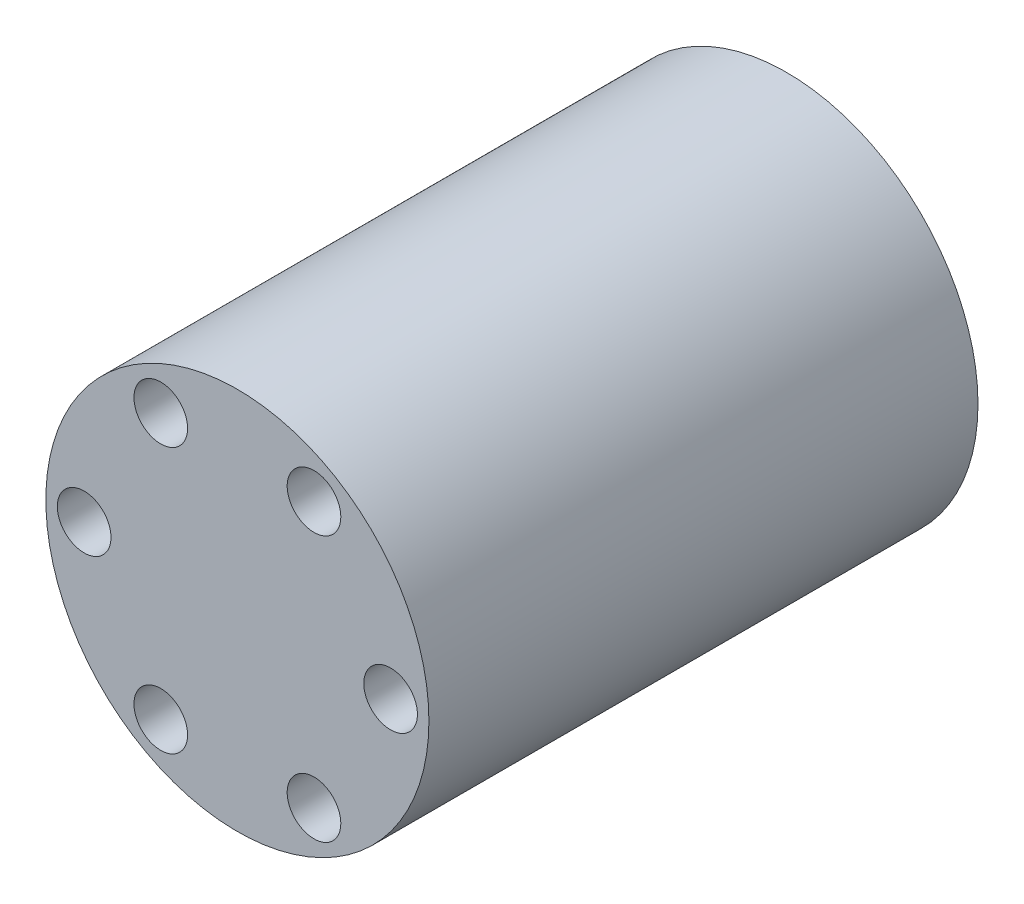
ISO-10303-21;
HEADER;
FILE_DESCRIPTION(('STEP AP214'),'2;1');
FILE_NAME('part.step','',(''),(''),'','','');
FILE_SCHEMA(('AUTOMOTIVE_DESIGN { 1 0 10303 214 1 1 1 1 }'));
ENDSEC;
DATA;
#1=APPLICATION_CONTEXT('core data for automotive mechanical design processes');
#2=APPLICATION_PROTOCOL_DEFINITION('international standard','automotive_design',2000,#1);
#3=PRODUCT_CONTEXT('',#1,'mechanical');
#4=PRODUCT('Part','Part','',(#3));
#5=PRODUCT_RELATED_PRODUCT_CATEGORY('part','',(#4));
#6=PRODUCT_DEFINITION_FORMATION('','',#4);
#7=PRODUCT_DEFINITION_CONTEXT('part definition',#1,'design');
#8=PRODUCT_DEFINITION('design','',#6,#7);
#9=PRODUCT_DEFINITION_SHAPE('','',#8);
#10=(LENGTH_UNIT() NAMED_UNIT(*) SI_UNIT(.MILLI.,.METRE.));
#11=(NAMED_UNIT(*) PLANE_ANGLE_UNIT() SI_UNIT($,.RADIAN.));
#12=(NAMED_UNIT(*) SI_UNIT($,.STERADIAN.) SOLID_ANGLE_UNIT());
#13=UNCERTAINTY_MEASURE_WITH_UNIT(LENGTH_MEASURE(1.E-05),#10,'distance_accuracy_value','');
#14=(GEOMETRIC_REPRESENTATION_CONTEXT(3) GLOBAL_UNCERTAINTY_ASSIGNED_CONTEXT((#13)) GLOBAL_UNIT_ASSIGNED_CONTEXT((#10,
#11,#12)) REPRESENTATION_CONTEXT('',''));
#15=CARTESIAN_POINT('',(0.,0.,0.));
#16=DIRECTION('',(0.,0.,1.));
#17=DIRECTION('',(1.,0.,0.));
#18=AXIS2_PLACEMENT_3D('',#15,#16,#17);
#19=CARTESIAN_POINT('',(0.,0.,21.5));
#20=DIRECTION('',(0.,0.,-1.));
#21=DIRECTION('',(-1.,0.,0.));
#22=AXIS2_PLACEMENT_3D('',#19,#20,#21);
#23=CYLINDRICAL_SURFACE('',#22,15.);
#24=CARTESIAN_POINT('',(0.,0.,21.5));
#25=DIRECTION('',(0.,0.,1.));
#26=DIRECTION('',(1.,0.,0.));
#27=AXIS2_PLACEMENT_3D('',#24,#25,#26);
#28=CIRCLE('',#27,15.);
#29=CARTESIAN_POINT('',(15.,0.,21.5));
#30=VERTEX_POINT('',#29);
#31=EDGE_CURVE('E10',#30,#30,#28,.T.);
#32=ORIENTED_EDGE('',*,*,#31,.F.);
#33=EDGE_LOOP('',(#32));
#34=FACE_BOUND('',#33,.T.);
#35=CARTESIAN_POINT('',(0.,0.,-21.5));
#36=DIRECTION('',(0.,0.,1.));
#37=DIRECTION('',(1.,0.,0.));
#38=AXIS2_PLACEMENT_3D('',#35,#36,#37);
#39=CIRCLE('',#38,15.);
#40=CARTESIAN_POINT('',(15.,0.,-21.5));
#41=VERTEX_POINT('',#40);
#42=EDGE_CURVE('E37',#41,#41,#39,.T.);
#43=ORIENTED_EDGE('',*,*,#42,.T.);
#44=EDGE_LOOP('',(#43));
#45=FACE_BOUND('',#44,.T.);
#46=ADVANCED_FACE('F40',(#34,#45),#23,.T.);
#47=CARTESIAN_POINT('',(0.,0.,21.5));
#48=DIRECTION('',(0.,0.,1.));
#49=DIRECTION('',(1.,0.,0.));
#50=AXIS2_PLACEMENT_3D('',#47,#48,#49);
#51=PLANE('',#50);
#52=CARTESIAN_POINT('',(-12.,0.,21.5));
#53=DIRECTION('',(0.,0.,1.));
#54=DIRECTION('',(1.,0.,0.));
#55=AXIS2_PLACEMENT_3D('',#52,#53,#54);
#56=CIRCLE('',#55,2.1);
#57=CARTESIAN_POINT('',(-9.9,0.,21.5));
#58=VERTEX_POINT('',#57);
#59=EDGE_CURVE('E74',#58,#58,#56,.T.);
#60=ORIENTED_EDGE('',*,*,#59,.F.);
#61=EDGE_LOOP('',(#60));
#62=FACE_BOUND('',#61,.T.);
#63=CARTESIAN_POINT('',(-6.,10.3923048454133,21.5));
#64=DIRECTION('',(0.,0.,1.));
#65=DIRECTION('',(1.,0.,0.));
#66=AXIS2_PLACEMENT_3D('',#63,#64,#65);
#67=CIRCLE('',#66,2.1);
#68=CARTESIAN_POINT('',(-3.9,10.3923048454133,21.5));
#69=VERTEX_POINT('',#68);
#70=EDGE_CURVE('E52',#69,#69,#67,.T.);
#71=ORIENTED_EDGE('',*,*,#70,.F.);
#72=EDGE_LOOP('',(#71));
#73=FACE_BOUND('',#72,.T.);
#74=CARTESIAN_POINT('',(6.,10.3923048454133,21.5));
#75=DIRECTION('',(0.,0.,1.));
#76=DIRECTION('',(1.,0.,0.));
#77=AXIS2_PLACEMENT_3D('',#74,#75,#76);
#78=CIRCLE('',#77,2.1);
#79=CARTESIAN_POINT('',(8.09999999999999,10.3923048454133,21.5));
#80=VERTEX_POINT('',#79);
#81=EDGE_CURVE('E55',#80,#80,#78,.T.);
#82=ORIENTED_EDGE('',*,*,#81,.F.);
#83=EDGE_LOOP('',(#82));
#84=FACE_BOUND('',#83,.T.);
#85=CARTESIAN_POINT('',(12.,0.,21.5));
#86=DIRECTION('',(0.,0.,1.));
#87=DIRECTION('',(1.,0.,0.));
#88=AXIS2_PLACEMENT_3D('',#85,#86,#87);
#89=CIRCLE('',#88,2.1);
#90=CARTESIAN_POINT('',(14.1,0.,21.5));
#91=VERTEX_POINT('',#90);
#92=EDGE_CURVE('E56',#91,#91,#89,.T.);
#93=ORIENTED_EDGE('',*,*,#92,.F.);
#94=EDGE_LOOP('',(#93));
#95=FACE_BOUND('',#94,.T.);
#96=CARTESIAN_POINT('',(6.00000000000001,-10.3923048454133,21.5));
#97=DIRECTION('',(0.,0.,1.));
#98=DIRECTION('',(1.,0.,0.));
#99=AXIS2_PLACEMENT_3D('',#96,#97,#98);
#100=CIRCLE('',#99,2.1);
#101=CARTESIAN_POINT('',(8.1,-10.3923048454133,21.5));
#102=VERTEX_POINT('',#101);
#103=EDGE_CURVE('E63',#102,#102,#100,.T.);
#104=ORIENTED_EDGE('',*,*,#103,.F.);
#105=EDGE_LOOP('',(#104));
#106=FACE_BOUND('',#105,.T.);
#107=CARTESIAN_POINT('',(-6.,-10.3923048454133,21.5));
#108=DIRECTION('',(0.,0.,1.));
#109=DIRECTION('',(1.,0.,0.));
#110=AXIS2_PLACEMENT_3D('',#107,#108,#109);
#111=CIRCLE('',#110,2.1);
#112=CARTESIAN_POINT('',(-3.9,-10.3923048454133,21.5));
#113=VERTEX_POINT('',#112);
#114=EDGE_CURVE('E72',#113,#113,#111,.T.);
#115=ORIENTED_EDGE('',*,*,#114,.F.);
#116=EDGE_LOOP('',(#115));
#117=FACE_BOUND('',#116,.T.);
#118=ORIENTED_EDGE('',*,*,#31,.T.);
#119=EDGE_LOOP('',(#118));
#120=FACE_BOUND('',#119,.T.);
#121=ADVANCED_FACE('F92',(#62,#73,#84,#95,#106,#117,#120),#51,.T.);
#122=CARTESIAN_POINT('',(0.,0.,-21.5));
#123=DIRECTION('',(0.,0.,1.));
#124=DIRECTION('',(1.,0.,0.));
#125=AXIS2_PLACEMENT_3D('',#122,#123,#124);
#126=PLANE('',#125);
#127=CARTESIAN_POINT('',(-12.,0.,-21.5));
#128=DIRECTION('',(0.,0.,1.));
#129=DIRECTION('',(1.,0.,0.));
#130=AXIS2_PLACEMENT_3D('',#127,#128,#129);
#131=CIRCLE('',#130,2.1);
#132=CARTESIAN_POINT('',(-9.9,0.,-21.5));
#133=VERTEX_POINT('',#132);
#134=EDGE_CURVE('E50',#133,#133,#131,.T.);
#135=ORIENTED_EDGE('',*,*,#134,.T.);
#136=EDGE_LOOP('',(#135));
#137=FACE_BOUND('',#136,.T.);
#138=CARTESIAN_POINT('',(-6.,10.3923048454133,-21.5));
#139=DIRECTION('',(0.,0.,1.));
#140=DIRECTION('',(1.,0.,0.));
#141=AXIS2_PLACEMENT_3D('',#138,#139,#140);
#142=CIRCLE('',#141,2.1);
#143=CARTESIAN_POINT('',(-3.9,10.3923048454133,-21.5));
#144=VERTEX_POINT('',#143);
#145=EDGE_CURVE('E73',#144,#144,#142,.T.);
#146=ORIENTED_EDGE('',*,*,#145,.T.);
#147=EDGE_LOOP('',(#146));
#148=FACE_BOUND('',#147,.T.);
#149=CARTESIAN_POINT('',(6.,10.3923048454133,-21.5));
#150=DIRECTION('',(0.,0.,1.));
#151=DIRECTION('',(1.,0.,0.));
#152=AXIS2_PLACEMENT_3D('',#149,#150,#151);
#153=CIRCLE('',#152,2.1);
#154=CARTESIAN_POINT('',(8.09999999999999,10.3923048454133,-21.5));
#155=VERTEX_POINT('',#154);
#156=EDGE_CURVE('E47',#155,#155,#153,.T.);
#157=ORIENTED_EDGE('',*,*,#156,.T.);
#158=EDGE_LOOP('',(#157));
#159=FACE_BOUND('',#158,.T.);
#160=CARTESIAN_POINT('',(12.,0.,-21.5));
#161=DIRECTION('',(0.,0.,1.));
#162=DIRECTION('',(1.,0.,0.));
#163=AXIS2_PLACEMENT_3D('',#160,#161,#162);
#164=CIRCLE('',#163,2.1);
#165=CARTESIAN_POINT('',(14.1,0.,-21.5));
#166=VERTEX_POINT('',#165);
#167=EDGE_CURVE('E57',#166,#166,#164,.T.);
#168=ORIENTED_EDGE('',*,*,#167,.T.);
#169=EDGE_LOOP('',(#168));
#170=FACE_BOUND('',#169,.T.);
#171=CARTESIAN_POINT('',(6.00000000000001,-10.3923048454133,-21.5));
#172=DIRECTION('',(0.,0.,1.));
#173=DIRECTION('',(1.,0.,0.));
#174=AXIS2_PLACEMENT_3D('',#171,#172,#173);
#175=CIRCLE('',#174,2.1);
#176=CARTESIAN_POINT('',(8.1,-10.3923048454133,-21.5));
#177=VERTEX_POINT('',#176);
#178=EDGE_CURVE('E65',#177,#177,#175,.T.);
#179=ORIENTED_EDGE('',*,*,#178,.T.);
#180=EDGE_LOOP('',(#179));
#181=FACE_BOUND('',#180,.T.);
#182=CARTESIAN_POINT('',(-6.,-10.3923048454133,-21.5));
#183=DIRECTION('',(0.,0.,1.));
#184=DIRECTION('',(1.,0.,0.));
#185=AXIS2_PLACEMENT_3D('',#182,#183,#184);
#186=CIRCLE('',#185,2.1);
#187=CARTESIAN_POINT('',(-3.9,-10.3923048454133,-21.5));
#188=VERTEX_POINT('',#187);
#189=EDGE_CURVE('E69',#188,#188,#186,.T.);
#190=ORIENTED_EDGE('',*,*,#189,.T.);
#191=EDGE_LOOP('',(#190));
#192=FACE_BOUND('',#191,.T.);
#193=ORIENTED_EDGE('',*,*,#42,.F.);
#194=EDGE_LOOP('',(#193));
#195=FACE_BOUND('',#194,.T.);
#196=ADVANCED_FACE('F85',(#137,#148,#159,#170,#181,#192,#195),#126,.F.);
#197=CARTESIAN_POINT('',(-6.,-10.3923048454133,-21.5));
#198=DIRECTION('',(0.,0.,1.));
#199=DIRECTION('',(1.,0.,0.));
#200=AXIS2_PLACEMENT_3D('',#197,#198,#199);
#201=CYLINDRICAL_SURFACE('',#200,2.1);
#202=ORIENTED_EDGE('',*,*,#189,.F.);
#203=EDGE_LOOP('',(#202));
#204=FACE_BOUND('',#203,.T.);
#205=ORIENTED_EDGE('',*,*,#114,.T.);
#206=EDGE_LOOP('',(#205));
#207=FACE_BOUND('',#206,.T.);
#208=ADVANCED_FACE('F108',(#204,#207),#201,.F.);
#209=CARTESIAN_POINT('',(6.00000000000001,-10.3923048454133,-21.5));
#210=DIRECTION('',(0.,0.,1.));
#211=DIRECTION('',(1.,0.,0.));
#212=AXIS2_PLACEMENT_3D('',#209,#210,#211);
#213=CYLINDRICAL_SURFACE('',#212,2.1);
#214=ORIENTED_EDGE('',*,*,#178,.F.);
#215=EDGE_LOOP('',(#214));
#216=FACE_BOUND('',#215,.T.);
#217=ORIENTED_EDGE('',*,*,#103,.T.);
#218=EDGE_LOOP('',(#217));
#219=FACE_BOUND('',#218,.T.);
#220=ADVANCED_FACE('F112',(#216,#219),#213,.F.);
#221=CARTESIAN_POINT('',(12.,0.,-21.5));
#222=DIRECTION('',(0.,0.,1.));
#223=DIRECTION('',(1.,0.,0.));
#224=AXIS2_PLACEMENT_3D('',#221,#222,#223);
#225=CYLINDRICAL_SURFACE('',#224,2.1);
#226=ORIENTED_EDGE('',*,*,#167,.F.);
#227=EDGE_LOOP('',(#226));
#228=FACE_BOUND('',#227,.T.);
#229=ORIENTED_EDGE('',*,*,#92,.T.);
#230=EDGE_LOOP('',(#229));
#231=FACE_BOUND('',#230,.T.);
#232=ADVANCED_FACE('F119',(#228,#231),#225,.F.);
#233=CARTESIAN_POINT('',(6.,10.3923048454133,-21.5));
#234=DIRECTION('',(0.,0.,1.));
#235=DIRECTION('',(1.,0.,0.));
#236=AXIS2_PLACEMENT_3D('',#233,#234,#235);
#237=CYLINDRICAL_SURFACE('',#236,2.1);
#238=ORIENTED_EDGE('',*,*,#156,.F.);
#239=EDGE_LOOP('',(#238));
#240=FACE_BOUND('',#239,.T.);
#241=ORIENTED_EDGE('',*,*,#81,.T.);
#242=EDGE_LOOP('',(#241));
#243=FACE_BOUND('',#242,.T.);
#244=ADVANCED_FACE('F159',(#240,#243),#237,.F.);
#245=CARTESIAN_POINT('',(-6.,10.3923048454133,-21.5));
#246=DIRECTION('',(0.,0.,1.));
#247=DIRECTION('',(1.,0.,0.));
#248=AXIS2_PLACEMENT_3D('',#245,#246,#247);
#249=CYLINDRICAL_SURFACE('',#248,2.1);
#250=ORIENTED_EDGE('',*,*,#145,.F.);
#251=EDGE_LOOP('',(#250));
#252=FACE_BOUND('',#251,.T.);
#253=ORIENTED_EDGE('',*,*,#70,.T.);
#254=EDGE_LOOP('',(#253));
#255=FACE_BOUND('',#254,.T.);
#256=ADVANCED_FACE('F93',(#252,#255),#249,.F.);
#257=CARTESIAN_POINT('',(-12.,0.,-21.5));
#258=DIRECTION('',(0.,0.,1.));
#259=DIRECTION('',(1.,0.,0.));
#260=AXIS2_PLACEMENT_3D('',#257,#258,#259);
#261=CYLINDRICAL_SURFACE('',#260,2.1);
#262=ORIENTED_EDGE('',*,*,#134,.F.);
#263=EDGE_LOOP('',(#262));
#264=FACE_BOUND('',#263,.T.);
#265=ORIENTED_EDGE('',*,*,#59,.T.);
#266=EDGE_LOOP('',(#265));
#267=FACE_BOUND('',#266,.T.);
#268=ADVANCED_FACE('F86',(#264,#267),#261,.F.);
#269=CLOSED_SHELL('',(#46,#121,#196,#208,#220,#232,#244,#256,#268));
#270=MANIFOLD_SOLID_BREP('B2',#269);
#271=ADVANCED_BREP_SHAPE_REPRESENTATION('',(#18,#270),#14);
#272=SHAPE_DEFINITION_REPRESENTATION(#9,#271);
ENDSEC;
END-ISO-10303-21;
